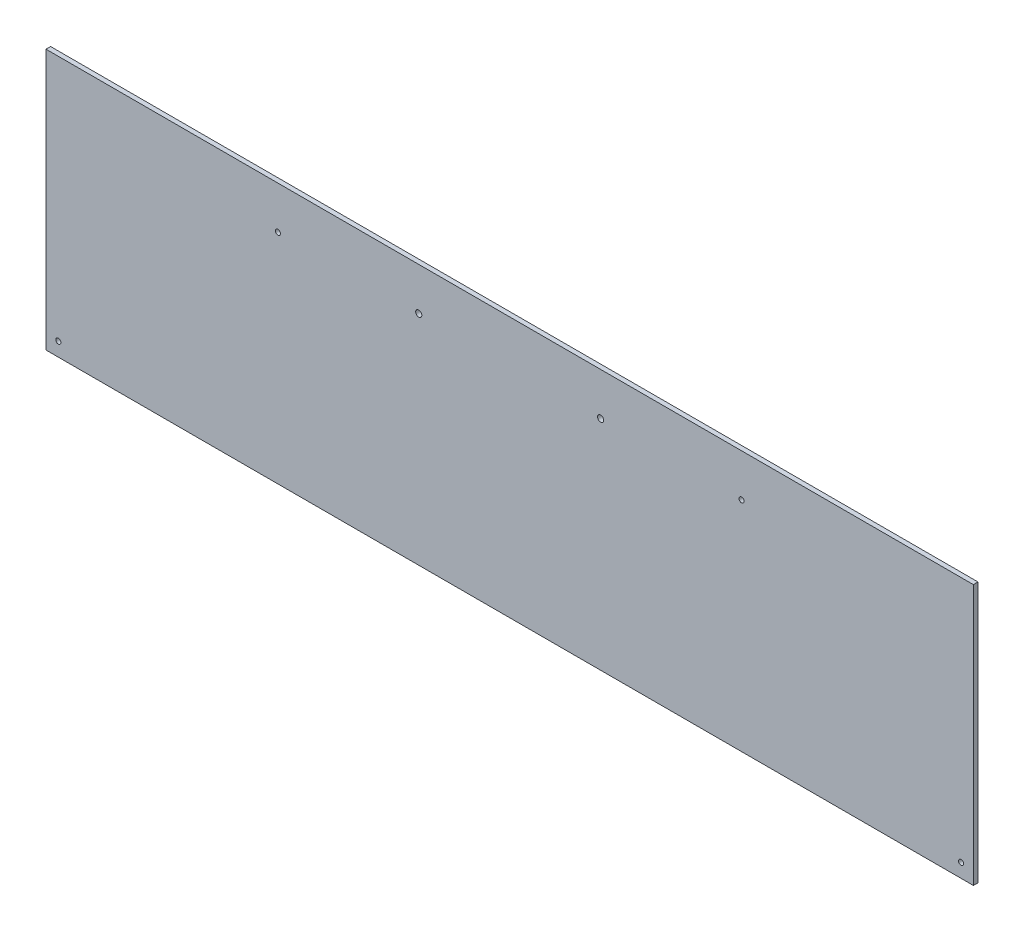
ISO-10303-21;
HEADER;
FILE_DESCRIPTION(('STEP AP214'),'2;1');
FILE_NAME('part.step','',(''),(''),'','','');
FILE_SCHEMA(('AUTOMOTIVE_DESIGN { 1 0 10303 214 1 1 1 1 }'));
ENDSEC;
DATA;
#1=APPLICATION_CONTEXT('core data for automotive mechanical design processes');
#2=APPLICATION_PROTOCOL_DEFINITION('international standard','automotive_design',2000,#1);
#3=PRODUCT_CONTEXT('',#1,'mechanical');
#4=PRODUCT('Part','Part','',(#3));
#5=PRODUCT_RELATED_PRODUCT_CATEGORY('part','',(#4));
#6=PRODUCT_DEFINITION_FORMATION('','',#4);
#7=PRODUCT_DEFINITION_CONTEXT('part definition',#1,'design');
#8=PRODUCT_DEFINITION('design','',#6,#7);
#9=PRODUCT_DEFINITION_SHAPE('','',#8);
#10=(LENGTH_UNIT() NAMED_UNIT(*) SI_UNIT(.MILLI.,.METRE.));
#11=(NAMED_UNIT(*) PLANE_ANGLE_UNIT() SI_UNIT($,.RADIAN.));
#12=(NAMED_UNIT(*) SI_UNIT($,.STERADIAN.) SOLID_ANGLE_UNIT());
#13=UNCERTAINTY_MEASURE_WITH_UNIT(LENGTH_MEASURE(1.E-05),#10,'distance_accuracy_value','');
#14=(GEOMETRIC_REPRESENTATION_CONTEXT(3) GLOBAL_UNCERTAINTY_ASSIGNED_CONTEXT((#13)) GLOBAL_UNIT_ASSIGNED_CONTEXT((#10,
#11,#12)) REPRESENTATION_CONTEXT('',''));
#15=CARTESIAN_POINT('',(0.,0.,0.));
#16=DIRECTION('',(0.,0.,1.));
#17=DIRECTION('',(1.,0.,0.));
#18=AXIS2_PLACEMENT_3D('',#15,#16,#17);
#19=CARTESIAN_POINT('',(0.,0.,4.5));
#20=DIRECTION('',(0.,0.,-1.));
#21=DIRECTION('',(-1.,0.,0.));
#22=AXIS2_PLACEMENT_3D('',#19,#20,#21);
#23=PLANE('',#22);
#24=DIRECTION('',(-1.,0.,0.));
#25=VECTOR('',#24,1.);
#26=CARTESIAN_POINT('',(-452.,118.5,4.5));
#27=LINE('',#26,#25);
#28=CARTESIAN_POINT('',(452.,118.5,4.5));
#29=VERTEX_POINT('',#28);
#30=CARTESIAN_POINT('',(-452.,118.5,4.5));
#31=VERTEX_POINT('',#30);
#32=EDGE_CURVE('E57',#29,#31,#27,.T.);
#33=ORIENTED_EDGE('',*,*,#32,.T.);
#34=DIRECTION('',(0.,-1.,0.));
#35=VECTOR('',#34,1.);
#36=CARTESIAN_POINT('',(-452.,118.5,4.5));
#37=LINE('',#36,#35);
#38=CARTESIAN_POINT('',(-452.,-135.5,4.5));
#39=VERTEX_POINT('',#38);
#40=EDGE_CURVE('E89',#31,#39,#37,.T.);
#41=ORIENTED_EDGE('',*,*,#40,.T.);
#42=DIRECTION('',(1.,0.,0.));
#43=VECTOR('',#42,1.);
#44=CARTESIAN_POINT('',(-452.,-135.5,4.5));
#45=LINE('',#44,#43);
#46=CARTESIAN_POINT('',(452.,-135.5,4.5));
#47=VERTEX_POINT('',#46);
#48=EDGE_CURVE('E93',#39,#47,#45,.T.);
#49=ORIENTED_EDGE('',*,*,#48,.T.);
#50=DIRECTION('',(0.,1.,0.));
#51=VECTOR('',#50,1.);
#52=CARTESIAN_POINT('',(452.,118.5,4.5));
#53=LINE('',#52,#51);
#54=EDGE_CURVE('E102',#47,#29,#53,.T.);
#55=ORIENTED_EDGE('',*,*,#54,.T.);
#56=EDGE_LOOP('',(#33,#41,#49,#55));
#57=FACE_BOUND('',#56,.T.);
#58=CARTESIAN_POINT('',(226.,77.,4.5));
#59=DIRECTION('',(0.,0.,1.));
#60=DIRECTION('',(-1.,0.,0.));
#61=AXIS2_PLACEMENT_3D('',#58,#59,#60);
#62=CIRCLE('',#61,2.5);
#63=CARTESIAN_POINT('',(223.5,77.,4.5));
#64=VERTEX_POINT('',#63);
#65=EDGE_CURVE('E111',#64,#64,#62,.T.);
#66=ORIENTED_EDGE('',*,*,#65,.F.);
#67=EDGE_LOOP('',(#66));
#68=FACE_BOUND('',#67,.T.);
#69=CARTESIAN_POINT('',(-226.,77.,4.5));
#70=DIRECTION('',(0.,0.,1.));
#71=DIRECTION('',(1.,0.,0.));
#72=AXIS2_PLACEMENT_3D('',#69,#70,#71);
#73=CIRCLE('',#72,2.5);
#74=CARTESIAN_POINT('',(-223.5,77.,4.5));
#75=VERTEX_POINT('',#74);
#76=EDGE_CURVE('E205',#75,#75,#73,.T.);
#77=ORIENTED_EDGE('',*,*,#76,.F.);
#78=EDGE_LOOP('',(#77));
#79=FACE_BOUND('',#78,.T.);
#80=CARTESIAN_POINT('',(-88.6171634135025,77.,4.5));
#81=DIRECTION('',(0.,0.,1.));
#82=DIRECTION('',(1.,0.,0.));
#83=AXIS2_PLACEMENT_3D('',#80,#81,#82);
#84=CIRCLE('',#83,3.00000000000001);
#85=CARTESIAN_POINT('',(-85.6171634135025,77.,4.5));
#86=VERTEX_POINT('',#85);
#87=EDGE_CURVE('E197',#86,#86,#84,.T.);
#88=ORIENTED_EDGE('',*,*,#87,.F.);
#89=EDGE_LOOP('',(#88));
#90=FACE_BOUND('',#89,.T.);
#91=CARTESIAN_POINT('',(88.6171634135027,77.,4.5));
#92=DIRECTION('',(0.,0.,1.));
#93=DIRECTION('',(-1.,0.,0.));
#94=AXIS2_PLACEMENT_3D('',#91,#92,#93);
#95=CIRCLE('',#94,3.00000000000001);
#96=CARTESIAN_POINT('',(85.6171634135027,77.,4.5));
#97=VERTEX_POINT('',#96);
#98=EDGE_CURVE('E189',#97,#97,#95,.T.);
#99=ORIENTED_EDGE('',*,*,#98,.F.);
#100=EDGE_LOOP('',(#99));
#101=FACE_BOUND('',#100,.T.);
#102=CARTESIAN_POINT('',(440.,-122.,4.5));
#103=DIRECTION('',(0.,0.,1.));
#104=DIRECTION('',(1.,0.,0.));
#105=AXIS2_PLACEMENT_3D('',#102,#103,#104);
#106=CIRCLE('',#105,2.50000000000002);
#107=CARTESIAN_POINT('',(442.5,-122.,4.5));
#108=VERTEX_POINT('',#107);
#109=EDGE_CURVE('E181',#108,#108,#106,.T.);
#110=ORIENTED_EDGE('',*,*,#109,.F.);
#111=EDGE_LOOP('',(#110));
#112=FACE_BOUND('',#111,.T.);
#113=CARTESIAN_POINT('',(-440.,-122.,4.5));
#114=DIRECTION('',(0.,0.,1.));
#115=DIRECTION('',(1.,0.,0.));
#116=AXIS2_PLACEMENT_3D('',#113,#114,#115);
#117=CIRCLE('',#116,2.50000000000002);
#118=CARTESIAN_POINT('',(-437.5,-122.,4.5));
#119=VERTEX_POINT('',#118);
#120=EDGE_CURVE('E170',#119,#119,#117,.T.);
#121=ORIENTED_EDGE('',*,*,#120,.F.);
#122=EDGE_LOOP('',(#121));
#123=FACE_BOUND('',#122,.T.);
#124=ADVANCED_FACE('F39',(#57,#68,#79,#90,#101,#112,#123),#23,.F.);
#125=CARTESIAN_POINT('',(0.,0.,0.));
#126=DIRECTION('',(0.,0.,-1.));
#127=DIRECTION('',(-1.,0.,0.));
#128=AXIS2_PLACEMENT_3D('',#125,#126,#127);
#129=PLANE('',#128);
#130=CARTESIAN_POINT('',(440.,-122.,0.));
#131=DIRECTION('',(0.,0.,1.));
#132=DIRECTION('',(1.,0.,0.));
#133=AXIS2_PLACEMENT_3D('',#130,#131,#132);
#134=CIRCLE('',#133,2.50000000000002);
#135=CARTESIAN_POINT('',(442.5,-122.,0.));
#136=VERTEX_POINT('',#135);
#137=EDGE_CURVE('E178',#136,#136,#134,.T.);
#138=ORIENTED_EDGE('',*,*,#137,.T.);
#139=EDGE_LOOP('',(#138));
#140=FACE_BOUND('',#139,.T.);
#141=CARTESIAN_POINT('',(-88.6171634135025,77.,0.));
#142=DIRECTION('',(0.,0.,1.));
#143=DIRECTION('',(1.,0.,0.));
#144=AXIS2_PLACEMENT_3D('',#141,#142,#143);
#145=CIRCLE('',#144,3.00000000000001);
#146=CARTESIAN_POINT('',(-85.6171634135025,77.,0.));
#147=VERTEX_POINT('',#146);
#148=EDGE_CURVE('E193',#147,#147,#145,.T.);
#149=ORIENTED_EDGE('',*,*,#148,.T.);
#150=EDGE_LOOP('',(#149));
#151=FACE_BOUND('',#150,.T.);
#152=CARTESIAN_POINT('',(226.,77.,0.));
#153=DIRECTION('',(0.,0.,1.));
#154=DIRECTION('',(-1.,0.,0.));
#155=AXIS2_PLACEMENT_3D('',#152,#153,#154);
#156=CIRCLE('',#155,2.5);
#157=CARTESIAN_POINT('',(223.5,77.,0.));
#158=VERTEX_POINT('',#157);
#159=EDGE_CURVE('E209',#158,#158,#156,.T.);
#160=ORIENTED_EDGE('',*,*,#159,.T.);
#161=EDGE_LOOP('',(#160));
#162=FACE_BOUND('',#161,.T.);
#163=DIRECTION('',(0.,-1.,0.));
#164=VECTOR('',#163,1.);
#165=CARTESIAN_POINT('',(-452.,118.5,0.));
#166=LINE('',#165,#164);
#167=CARTESIAN_POINT('',(-452.,118.5,0.));
#168=VERTEX_POINT('',#167);
#169=CARTESIAN_POINT('',(-452.,-135.5,0.));
#170=VERTEX_POINT('',#169);
#171=EDGE_CURVE('E96',#168,#170,#166,.T.);
#172=ORIENTED_EDGE('',*,*,#171,.F.);
#173=DIRECTION('',(-1.,0.,0.));
#174=VECTOR('',#173,1.);
#175=CARTESIAN_POINT('',(-228.5,118.5,0.));
#176=LINE('',#175,#174);
#177=CARTESIAN_POINT('',(452.,118.5,0.));
#178=VERTEX_POINT('',#177);
#179=EDGE_CURVE('E82',#178,#168,#176,.T.);
#180=ORIENTED_EDGE('',*,*,#179,.F.);
#181=DIRECTION('',(0.,1.,0.));
#182=VECTOR('',#181,1.);
#183=CARTESIAN_POINT('',(452.,118.5,0.));
#184=LINE('',#183,#182);
#185=CARTESIAN_POINT('',(452.,-135.5,0.));
#186=VERTEX_POINT('',#185);
#187=EDGE_CURVE('E114',#186,#178,#184,.T.);
#188=ORIENTED_EDGE('',*,*,#187,.F.);
#189=DIRECTION('',(1.,0.,0.));
#190=VECTOR('',#189,1.);
#191=CARTESIAN_POINT('',(-452.,-135.5,0.));
#192=LINE('',#191,#190);
#193=EDGE_CURVE('E75',#170,#186,#192,.T.);
#194=ORIENTED_EDGE('',*,*,#193,.F.);
#195=EDGE_LOOP('',(#172,#180,#188,#194));
#196=FACE_BOUND('',#195,.T.);
#197=CARTESIAN_POINT('',(-226.,77.,0.));
#198=DIRECTION('',(0.,0.,1.));
#199=DIRECTION('',(1.,0.,0.));
#200=AXIS2_PLACEMENT_3D('',#197,#198,#199);
#201=CIRCLE('',#200,2.5);
#202=CARTESIAN_POINT('',(-223.5,77.,0.));
#203=VERTEX_POINT('',#202);
#204=EDGE_CURVE('E201',#203,#203,#201,.T.);
#205=ORIENTED_EDGE('',*,*,#204,.T.);
#206=EDGE_LOOP('',(#205));
#207=FACE_BOUND('',#206,.T.);
#208=CARTESIAN_POINT('',(88.6171634135027,77.,0.));
#209=DIRECTION('',(0.,0.,1.));
#210=DIRECTION('',(-1.,0.,0.));
#211=AXIS2_PLACEMENT_3D('',#208,#209,#210);
#212=CIRCLE('',#211,3.00000000000001);
#213=CARTESIAN_POINT('',(85.6171634135027,77.,0.));
#214=VERTEX_POINT('',#213);
#215=EDGE_CURVE('E185',#214,#214,#212,.T.);
#216=ORIENTED_EDGE('',*,*,#215,.T.);
#217=EDGE_LOOP('',(#216));
#218=FACE_BOUND('',#217,.T.);
#219=CARTESIAN_POINT('',(-440.,-122.,0.));
#220=DIRECTION('',(0.,0.,1.));
#221=DIRECTION('',(1.,0.,0.));
#222=AXIS2_PLACEMENT_3D('',#219,#220,#221);
#223=CIRCLE('',#222,2.50000000000002);
#224=CARTESIAN_POINT('',(-437.5,-122.,0.));
#225=VERTEX_POINT('',#224);
#226=EDGE_CURVE('E173',#225,#225,#223,.T.);
#227=ORIENTED_EDGE('',*,*,#226,.T.);
#228=EDGE_LOOP('',(#227));
#229=FACE_BOUND('',#228,.T.);
#230=ADVANCED_FACE('F125',(#140,#151,#162,#196,#207,#218,#229),#129,.T.);
#231=CARTESIAN_POINT('',(-452.,118.5,4.5));
#232=DIRECTION('',(1.,0.,0.));
#233=DIRECTION('',(0.,0.,-1.));
#234=AXIS2_PLACEMENT_3D('',#231,#232,#233);
#235=PLANE('',#234);
#236=ORIENTED_EDGE('',*,*,#171,.T.);
#237=DIRECTION('',(0.,0.,-1.));
#238=VECTOR('',#237,1.);
#239=CARTESIAN_POINT('',(-452.,-135.5,4.5));
#240=LINE('',#239,#238);
#241=EDGE_CURVE('E49',#39,#170,#240,.T.);
#242=ORIENTED_EDGE('',*,*,#241,.F.);
#243=ORIENTED_EDGE('',*,*,#40,.F.);
#244=DIRECTION('',(0.,0.,-1.));
#245=VECTOR('',#244,1.);
#246=CARTESIAN_POINT('',(-452.,118.5,4.5));
#247=LINE('',#246,#245);
#248=EDGE_CURVE('E11',#31,#168,#247,.T.);
#249=ORIENTED_EDGE('',*,*,#248,.T.);
#250=EDGE_LOOP('',(#236,#242,#243,#249));
#251=FACE_BOUND('',#250,.T.);
#252=ADVANCED_FACE('F41',(#251),#235,.F.);
#253=CARTESIAN_POINT('',(-452.,-135.5,4.5));
#254=DIRECTION('',(0.,1.,0.));
#255=DIRECTION('',(0.,0.,1.));
#256=AXIS2_PLACEMENT_3D('',#253,#254,#255);
#257=PLANE('',#256);
#258=ORIENTED_EDGE('',*,*,#193,.T.);
#259=DIRECTION('',(0.,0.,-1.));
#260=VECTOR('',#259,1.);
#261=CARTESIAN_POINT('',(452.,-135.5,4.5));
#262=LINE('',#261,#260);
#263=EDGE_CURVE('E98',#47,#186,#262,.T.);
#264=ORIENTED_EDGE('',*,*,#263,.F.);
#265=ORIENTED_EDGE('',*,*,#48,.F.);
#266=ORIENTED_EDGE('',*,*,#241,.T.);
#267=EDGE_LOOP('',(#258,#264,#265,#266));
#268=FACE_BOUND('',#267,.T.);
#269=ADVANCED_FACE('F99',(#268),#257,.F.);
#270=CARTESIAN_POINT('',(452.,118.5,4.5));
#271=DIRECTION('',(-1.,0.,0.));
#272=DIRECTION('',(0.,0.,1.));
#273=AXIS2_PLACEMENT_3D('',#270,#271,#272);
#274=PLANE('',#273);
#275=ORIENTED_EDGE('',*,*,#187,.T.);
#276=DIRECTION('',(0.,0.,-1.));
#277=VECTOR('',#276,1.);
#278=CARTESIAN_POINT('',(452.,118.5,4.5));
#279=LINE('',#278,#277);
#280=EDGE_CURVE('E105',#29,#178,#279,.T.);
#281=ORIENTED_EDGE('',*,*,#280,.F.);
#282=ORIENTED_EDGE('',*,*,#54,.F.);
#283=ORIENTED_EDGE('',*,*,#263,.T.);
#284=EDGE_LOOP('',(#275,#281,#282,#283));
#285=FACE_BOUND('',#284,.T.);
#286=ADVANCED_FACE('F123',(#285),#274,.F.);
#287=CARTESIAN_POINT('',(-228.5,118.5,4.5));
#288=DIRECTION('',(0.,-1.,0.));
#289=DIRECTION('',(0.,0.,-1.));
#290=AXIS2_PLACEMENT_3D('',#287,#288,#289);
#291=PLANE('',#290);
#292=ORIENTED_EDGE('',*,*,#179,.T.);
#293=ORIENTED_EDGE('',*,*,#248,.F.);
#294=ORIENTED_EDGE('',*,*,#32,.F.);
#295=ORIENTED_EDGE('',*,*,#280,.T.);
#296=EDGE_LOOP('',(#292,#293,#294,#295));
#297=FACE_BOUND('',#296,.T.);
#298=ADVANCED_FACE('F127',(#297),#291,.F.);
#299=CARTESIAN_POINT('',(226.,77.,4.5));
#300=DIRECTION('',(0.,0.,-1.));
#301=DIRECTION('',(-1.,0.,0.));
#302=AXIS2_PLACEMENT_3D('',#299,#300,#301);
#303=CYLINDRICAL_SURFACE('',#302,2.5);
#304=ORIENTED_EDGE('',*,*,#65,.T.);
#305=EDGE_LOOP('',(#304));
#306=FACE_BOUND('',#305,.T.);
#307=ORIENTED_EDGE('',*,*,#159,.F.);
#308=EDGE_LOOP('',(#307));
#309=FACE_BOUND('',#308,.T.);
#310=ADVANCED_FACE('F129',(#306,#309),#303,.F.);
#311=CARTESIAN_POINT('',(-226.,77.,4.5));
#312=DIRECTION('',(0.,0.,-1.));
#313=DIRECTION('',(-1.,0.,0.));
#314=AXIS2_PLACEMENT_3D('',#311,#312,#313);
#315=CYLINDRICAL_SURFACE('',#314,2.5);
#316=ORIENTED_EDGE('',*,*,#76,.T.);
#317=EDGE_LOOP('',(#316));
#318=FACE_BOUND('',#317,.T.);
#319=ORIENTED_EDGE('',*,*,#204,.F.);
#320=EDGE_LOOP('',(#319));
#321=FACE_BOUND('',#320,.T.);
#322=ADVANCED_FACE('F135',(#318,#321),#315,.F.);
#323=CARTESIAN_POINT('',(-88.6171634135025,77.,4.5));
#324=DIRECTION('',(0.,0.,-1.));
#325=DIRECTION('',(-1.,0.,0.));
#326=AXIS2_PLACEMENT_3D('',#323,#324,#325);
#327=CYLINDRICAL_SURFACE('',#326,3.00000000000001);
#328=ORIENTED_EDGE('',*,*,#87,.T.);
#329=EDGE_LOOP('',(#328));
#330=FACE_BOUND('',#329,.T.);
#331=ORIENTED_EDGE('',*,*,#148,.F.);
#332=EDGE_LOOP('',(#331));
#333=FACE_BOUND('',#332,.T.);
#334=ADVANCED_FACE('F149',(#330,#333),#327,.F.);
#335=CARTESIAN_POINT('',(88.6171634135027,77.,4.5));
#336=DIRECTION('',(0.,0.,-1.));
#337=DIRECTION('',(-1.,0.,0.));
#338=AXIS2_PLACEMENT_3D('',#335,#336,#337);
#339=CYLINDRICAL_SURFACE('',#338,3.00000000000001);
#340=ORIENTED_EDGE('',*,*,#98,.T.);
#341=EDGE_LOOP('',(#340));
#342=FACE_BOUND('',#341,.T.);
#343=ORIENTED_EDGE('',*,*,#215,.F.);
#344=EDGE_LOOP('',(#343));
#345=FACE_BOUND('',#344,.T.);
#346=ADVANCED_FACE('F153',(#342,#345),#339,.F.);
#347=CARTESIAN_POINT('',(440.,-122.,4.5));
#348=DIRECTION('',(0.,0.,-1.));
#349=DIRECTION('',(-1.,0.,0.));
#350=AXIS2_PLACEMENT_3D('',#347,#348,#349);
#351=CYLINDRICAL_SURFACE('',#350,2.50000000000002);
#352=ORIENTED_EDGE('',*,*,#109,.T.);
#353=EDGE_LOOP('',(#352));
#354=FACE_BOUND('',#353,.T.);
#355=ORIENTED_EDGE('',*,*,#137,.F.);
#356=EDGE_LOOP('',(#355));
#357=FACE_BOUND('',#356,.T.);
#358=ADVANCED_FACE('F157',(#354,#357),#351,.F.);
#359=CARTESIAN_POINT('',(-440.,-122.,4.5));
#360=DIRECTION('',(0.,0.,-1.));
#361=DIRECTION('',(-1.,0.,0.));
#362=AXIS2_PLACEMENT_3D('',#359,#360,#361);
#363=CYLINDRICAL_SURFACE('',#362,2.50000000000002);
#364=ORIENTED_EDGE('',*,*,#120,.T.);
#365=EDGE_LOOP('',(#364));
#366=FACE_BOUND('',#365,.T.);
#367=ORIENTED_EDGE('',*,*,#226,.F.);
#368=EDGE_LOOP('',(#367));
#369=FACE_BOUND('',#368,.T.);
#370=ADVANCED_FACE('F161',(#366,#369),#363,.F.);
#371=CLOSED_SHELL('',(#124,#230,#252,#269,#286,#298,#310,#322,#334,#346,#358,#370));
#372=MANIFOLD_SOLID_BREP('B2',#371);
#373=ADVANCED_BREP_SHAPE_REPRESENTATION('',(#18,#372),#14);
#374=SHAPE_DEFINITION_REPRESENTATION(#9,#373);
ENDSEC;
END-ISO-10303-21;
